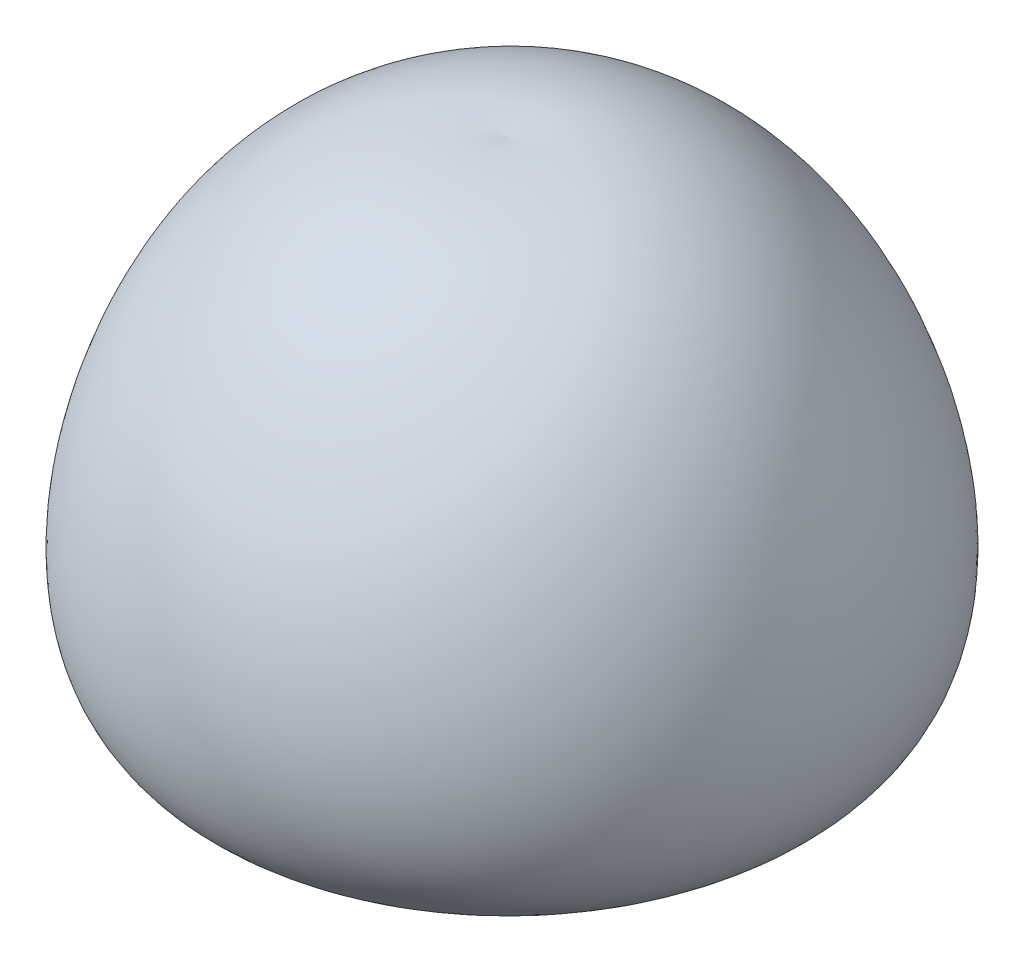
ISO-10303-21;
HEADER;
FILE_DESCRIPTION(('STEP AP214'),'2;1');
FILE_NAME('part.step','',(''),(''),'','','');
FILE_SCHEMA(('AUTOMOTIVE_DESIGN { 1 0 10303 214 1 1 1 1 }'));
ENDSEC;
DATA;
#1=APPLICATION_CONTEXT('core data for automotive mechanical design processes');
#2=APPLICATION_PROTOCOL_DEFINITION('international standard','automotive_design',2000,#1);
#3=PRODUCT_CONTEXT('',#1,'mechanical');
#4=PRODUCT('Part','Part','',(#3));
#5=PRODUCT_RELATED_PRODUCT_CATEGORY('part','',(#4));
#6=PRODUCT_DEFINITION_FORMATION('','',#4);
#7=PRODUCT_DEFINITION_CONTEXT('part definition',#1,'design');
#8=PRODUCT_DEFINITION('design','',#6,#7);
#9=PRODUCT_DEFINITION_SHAPE('','',#8);
#10=(LENGTH_UNIT() NAMED_UNIT(*) SI_UNIT(.MILLI.,.METRE.));
#11=(NAMED_UNIT(*) PLANE_ANGLE_UNIT() SI_UNIT($,.RADIAN.));
#12=(NAMED_UNIT(*) SI_UNIT($,.STERADIAN.) SOLID_ANGLE_UNIT());
#13=UNCERTAINTY_MEASURE_WITH_UNIT(LENGTH_MEASURE(1.E-05),#10,'distance_accuracy_value','');
#14=(GEOMETRIC_REPRESENTATION_CONTEXT(3) GLOBAL_UNCERTAINTY_ASSIGNED_CONTEXT((#13)) GLOBAL_UNIT_ASSIGNED_CONTEXT((#10,
#11,#12)) REPRESENTATION_CONTEXT('',''));
#15=CARTESIAN_POINT('',(0.,0.,0.));
#16=DIRECTION('',(0.,0.,1.));
#17=DIRECTION('',(1.,0.,0.));
#18=AXIS2_PLACEMENT_3D('',#15,#16,#17);
#19=CARTESIAN_POINT('',(2.31631937654757,8.07736461794808,0.));
#20=CARTESIAN_POINT('',(-0.845658428561162,8.43061383279692,0.));
#21=CARTESIAN_POINT('',(-6.708222967977,3.23553476236437,0.));
#22=CARTESIAN_POINT('',(-5.43597620827353,-6.46847863598216,0.));
#23=CARTESIAN_POINT('',(2.47354495768025,-1.92263538205192,0.));
#24=B_SPLINE_CURVE_WITH_KNOTS('',3,(#19,#20,#21,#22,#23),.UNSPECIFIED.,.F.,.F.,(4,1,4),(0.,
0.408524991802706,1.),.UNSPECIFIED.);
#25=CARTESIAN_POINT('',(2.31631937654757,8.07736461794808,0.));
#26=DIRECTION('',(-0.0157206151744664,0.999876423493692,0.));
#27=AXIS1_PLACEMENT('',#25,#26);
#28=SURFACE_OF_REVOLUTION('',#24,#27);
#29=CARTESIAN_POINT('',(2.47354495768025,-1.92263538205192,0.));
#30=VERTEX_POINT('',#29);
#31=VERTEX_LOOP('',#30);
#32=FACE_BOUND('',#31,.T.);
#33=CARTESIAN_POINT('',(2.31631937654757,8.07736461794808,0.));
#34=VERTEX_POINT('',#33);
#35=VERTEX_LOOP('',#34);
#36=FACE_BOUND('',#35,.T.);
#37=ADVANCED_FACE('F38',(#32,#36),#28,.F.);
#38=CLOSED_SHELL('',(#37));
#39=MANIFOLD_SOLID_BREP('B2',#38);
#40=ADVANCED_BREP_SHAPE_REPRESENTATION('',(#18,#39),#14);
#41=SHAPE_DEFINITION_REPRESENTATION(#9,#40);
ENDSEC;
END-ISO-10303-21;
